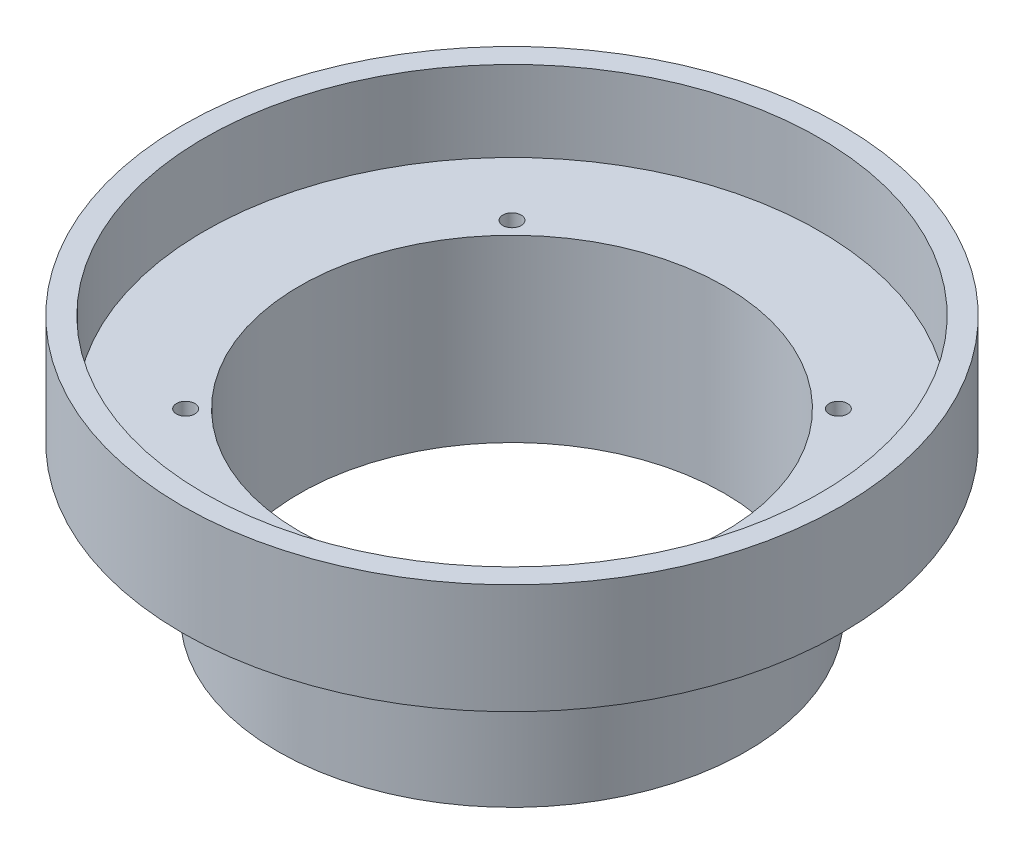
ISO-10303-21;
HEADER;
FILE_DESCRIPTION(('STEP AP214'),'2;1');
FILE_NAME('part.step','',(''),(''),'','','');
FILE_SCHEMA(('AUTOMOTIVE_DESIGN { 1 0 10303 214 1 1 1 1 }'));
ENDSEC;
DATA;
#1=APPLICATION_CONTEXT('core data for automotive mechanical design processes');
#2=APPLICATION_PROTOCOL_DEFINITION('international standard','automotive_design',2000,#1);
#3=PRODUCT_CONTEXT('',#1,'mechanical');
#4=PRODUCT('Part','Part','',(#3));
#5=PRODUCT_RELATED_PRODUCT_CATEGORY('part','',(#4));
#6=PRODUCT_DEFINITION_FORMATION('','',#4);
#7=PRODUCT_DEFINITION_CONTEXT('part definition',#1,'design');
#8=PRODUCT_DEFINITION('design','',#6,#7);
#9=PRODUCT_DEFINITION_SHAPE('','',#8);
#10=(LENGTH_UNIT() NAMED_UNIT(*) SI_UNIT(.MILLI.,.METRE.));
#11=(NAMED_UNIT(*) PLANE_ANGLE_UNIT() SI_UNIT($,.RADIAN.));
#12=(NAMED_UNIT(*) SI_UNIT($,.STERADIAN.) SOLID_ANGLE_UNIT());
#13=UNCERTAINTY_MEASURE_WITH_UNIT(LENGTH_MEASURE(1.E-05),#10,'distance_accuracy_value','');
#14=(GEOMETRIC_REPRESENTATION_CONTEXT(3) GLOBAL_UNCERTAINTY_ASSIGNED_CONTEXT((#13)) GLOBAL_UNIT_ASSIGNED_CONTEXT((#10,
#11,#12)) REPRESENTATION_CONTEXT('',''));
#15=CARTESIAN_POINT('',(0.,0.,0.));
#16=DIRECTION('',(0.,0.,1.));
#17=DIRECTION('',(1.,0.,0.));
#18=AXIS2_PLACEMENT_3D('',#15,#16,#17);
#19=CARTESIAN_POINT('',(0.,20.5,0.));
#20=DIRECTION('',(0.,1.,0.));
#21=DIRECTION('',(0.,0.,1.));
#22=AXIS2_PLACEMENT_3D('',#19,#20,#21);
#23=PLANE('',#22);
#24=CARTESIAN_POINT('',(0.,20.5,0.));
#25=DIRECTION('',(0.,1.,0.));
#26=DIRECTION('',(0.,0.,1.));
#27=AXIS2_PLACEMENT_3D('',#24,#25,#26);
#28=CIRCLE('',#27,45.);
#29=CARTESIAN_POINT('',(0.,20.5,45.));
#30=VERTEX_POINT('',#29);
#31=EDGE_CURVE('E110',#30,#30,#28,.T.);
#32=ORIENTED_EDGE('',*,*,#31,.F.);
#33=EDGE_LOOP('',(#32));
#34=FACE_BOUND('',#33,.T.);
#35=CARTESIAN_POINT('',(-22.2738636073763,20.5,-22.2738636073762));
#36=DIRECTION('',(0.,1.,0.));
#37=DIRECTION('',(0.,0.,1.));
#38=AXIS2_PLACEMENT_3D('',#35,#36,#37);
#39=CIRCLE('',#38,1.24999999999999);
#40=CARTESIAN_POINT('',(-23.4290492834822,20.5,-21.7963219299074));
#41=VERTEX_POINT('',#40);
#42=CARTESIAN_POINT('',(-21.7963219299074,20.5,-23.4290492834822));
#43=VERTEX_POINT('',#42);
#44=EDGE_CURVE('E59',#41,#43,#39,.F.);
#45=ORIENTED_EDGE('',*,*,#44,.F.);
#46=CARTESIAN_POINT('',(0.,20.5,0.));
#47=DIRECTION('',(0.,1.,0.));
#48=DIRECTION('',(0.,0.,1.));
#49=AXIS2_PLACEMENT_3D('',#46,#47,#48);
#50=CIRCLE('',#49,32.);
#51=CARTESIAN_POINT('',(-23.4290492834822,20.5,21.7963219299075));
#52=VERTEX_POINT('',#51);
#53=EDGE_CURVE('E53',#41,#52,#50,.T.);
#54=ORIENTED_EDGE('',*,*,#53,.T.);
#55=CARTESIAN_POINT('',(-22.2738636073763,20.5,22.2738636073762));
#56=DIRECTION('',(0.,1.,0.));
#57=DIRECTION('',(0.,0.,1.));
#58=AXIS2_PLACEMENT_3D('',#55,#56,#57);
#59=CIRCLE('',#58,1.24999999999999);
#60=CARTESIAN_POINT('',(-21.7963219299075,20.5,23.4290492834821));
#61=VERTEX_POINT('',#60);
#62=EDGE_CURVE('E128',#61,#52,#59,.F.);
#63=ORIENTED_EDGE('',*,*,#62,.F.);
#64=CARTESIAN_POINT('',(21.7963219299075,20.5,23.4290492834822));
#65=VERTEX_POINT('',#64);
#66=EDGE_CURVE('E51',#61,#65,#50,.T.);
#67=ORIENTED_EDGE('',*,*,#66,.T.);
#68=CARTESIAN_POINT('',(22.2738636073762,20.5,22.2738636073762));
#69=DIRECTION('',(0.,1.,0.));
#70=DIRECTION('',(0.,0.,1.));
#71=AXIS2_PLACEMENT_3D('',#68,#69,#70);
#72=CIRCLE('',#71,1.24999999999999);
#73=CARTESIAN_POINT('',(23.4290492834821,20.5,21.7963219299075));
#74=VERTEX_POINT('',#73);
#75=EDGE_CURVE('E134',#74,#65,#72,.F.);
#76=ORIENTED_EDGE('',*,*,#75,.F.);
#77=CARTESIAN_POINT('',(23.4290492834821,20.5,-21.7963219299075));
#78=VERTEX_POINT('',#77);
#79=EDGE_CURVE('E354',#74,#78,#50,.T.);
#80=ORIENTED_EDGE('',*,*,#79,.T.);
#81=CARTESIAN_POINT('',(22.2738636073762,20.5,-22.2738636073763));
#82=DIRECTION('',(0.,1.,0.));
#83=DIRECTION('',(0.,0.,1.));
#84=AXIS2_PLACEMENT_3D('',#81,#82,#83);
#85=CIRCLE('',#84,1.24999999999999);
#86=CARTESIAN_POINT('',(21.7963219299074,20.5,-23.4290492834822));
#87=VERTEX_POINT('',#86);
#88=EDGE_CURVE('E66',#87,#78,#85,.F.);
#89=ORIENTED_EDGE('',*,*,#88,.F.);
#90=EDGE_CURVE('E94',#87,#43,#50,.T.);
#91=ORIENTED_EDGE('',*,*,#90,.T.);
#92=EDGE_LOOP('',(#45,#54,#63,#67,#76,#80,#89,#91));
#93=FACE_BOUND('',#92,.T.);
#94=ADVANCED_FACE('F42',(#34,#93),#23,.F.);
#95=CARTESIAN_POINT('',(0.,117.52438661764,0.));
#96=DIRECTION('',(0.,-1.,0.));
#97=DIRECTION('',(0.,0.,-1.));
#98=AXIS2_PLACEMENT_3D('',#95,#96,#97);
#99=CYLINDRICAL_SURFACE('',#98,29.);
#100=CARTESIAN_POINT('',(0.,0.,0.));
#101=DIRECTION('',(0.,1.,0.));
#102=DIRECTION('',(0.,0.,1.));
#103=AXIS2_PLACEMENT_3D('',#100,#101,#102);
#104=CIRCLE('',#103,29.);
#105=CARTESIAN_POINT('',(0.,0.,-29.));
#106=VERTEX_POINT('',#105);
#107=EDGE_CURVE('E113',#106,#106,#104,.T.);
#108=CARTESIAN_POINT('',(0.,24.5,0.));
#109=DIRECTION('',(0.,1.,0.));
#110=DIRECTION('',(0.,0.,1.));
#111=AXIS2_PLACEMENT_3D('',#108,#109,#110);
#112=CIRCLE('',#111,29.);
#113=CARTESIAN_POINT('',(0.,24.5,-29.));
#114=VERTEX_POINT('',#113);
#115=EDGE_CURVE('E46',#114,#114,#112,.T.);
#116=CARTESIAN_POINT('',(0.,0.,-29.));
#117=CARTESIAN_POINT('',(0.,0.255208333333322,-29.));
#118=CARTESIAN_POINT('',(0.,0.510416666666657,-29.));
#119=CARTESIAN_POINT('',(0.,1.02083333333332,-29.));
#120=CARTESIAN_POINT('',(0.,1.27604166666665,-29.));
#121=CARTESIAN_POINT('',(0.,1.78645833333332,-29.));
#122=CARTESIAN_POINT('',(0.,2.04166666666665,-29.));
#123=CARTESIAN_POINT('',(0.,2.55208333333332,-29.));
#124=CARTESIAN_POINT('',(0.,2.80729166666665,-29.));
#125=CARTESIAN_POINT('',(0.,3.31770833333332,-29.));
#126=CARTESIAN_POINT('',(0.,3.57291666666665,-29.));
#127=CARTESIAN_POINT('',(0.,4.08333333333332,-29.));
#128=CARTESIAN_POINT('',(0.,4.33854166666665,-29.));
#129=CARTESIAN_POINT('',(0.,4.84895833333332,-29.));
#130=CARTESIAN_POINT('',(0.,5.10416666666665,-29.));
#131=CARTESIAN_POINT('',(0.,5.61458333333332,-29.));
#132=CARTESIAN_POINT('',(0.,5.86979166666665,-29.));
#133=CARTESIAN_POINT('',(0.,6.38020833333331,-29.));
#134=CARTESIAN_POINT('',(0.,6.63541666666665,-29.));
#135=CARTESIAN_POINT('',(0.,7.14583333333332,-29.));
#136=CARTESIAN_POINT('',(0.,7.40104166666665,-29.));
#137=CARTESIAN_POINT('',(0.,7.91145833333332,-29.));
#138=CARTESIAN_POINT('',(0.,8.16666666666665,-29.));
#139=CARTESIAN_POINT('',(0.,8.67708333333332,-29.));
#140=CARTESIAN_POINT('',(0.,8.93229166666665,-29.));
#141=CARTESIAN_POINT('',(0.,9.44270833333332,-29.));
#142=CARTESIAN_POINT('',(0.,9.69791666666665,-29.));
#143=CARTESIAN_POINT('',(0.,10.2083333333333,-29.));
#144=CARTESIAN_POINT('',(0.,10.4635416666667,-29.));
#145=CARTESIAN_POINT('',(0.,10.9739583333333,-29.));
#146=CARTESIAN_POINT('',(0.,11.2291666666666,-29.));
#147=CARTESIAN_POINT('',(0.,11.7395833333333,-29.));
#148=CARTESIAN_POINT('',(0.,11.9947916666666,-29.));
#149=CARTESIAN_POINT('',(0.,12.5052083333333,-29.));
#150=CARTESIAN_POINT('',(0.,12.7604166666667,-29.));
#151=CARTESIAN_POINT('',(0.,13.2708333333333,-29.));
#152=CARTESIAN_POINT('',(0.,13.5260416666667,-29.));
#153=CARTESIAN_POINT('',(0.,14.0364583333333,-29.));
#154=CARTESIAN_POINT('',(0.,14.2916666666667,-29.));
#155=CARTESIAN_POINT('',(0.,14.8020833333333,-29.));
#156=CARTESIAN_POINT('',(0.,15.0572916666666,-29.));
#157=CARTESIAN_POINT('',(0.,15.5677083333333,-29.));
#158=CARTESIAN_POINT('',(0.,15.8229166666666,-29.));
#159=CARTESIAN_POINT('',(0.,16.3333333333333,-29.));
#160=CARTESIAN_POINT('',(0.,16.5885416666666,-29.));
#161=CARTESIAN_POINT('',(0.,17.0989583333333,-29.));
#162=CARTESIAN_POINT('',(0.,17.3541666666666,-29.));
#163=CARTESIAN_POINT('',(0.,17.8645833333333,-29.));
#164=CARTESIAN_POINT('',(0.,18.1197916666667,-29.));
#165=CARTESIAN_POINT('',(0.,18.6302083333333,-29.));
#166=CARTESIAN_POINT('',(0.,18.8854166666667,-29.));
#167=CARTESIAN_POINT('',(0.,19.3958333333333,-29.));
#168=CARTESIAN_POINT('',(0.,19.6510416666666,-29.));
#169=CARTESIAN_POINT('',(0.,20.1614583333333,-29.));
#170=CARTESIAN_POINT('',(0.,20.4166666666666,-29.));
#171=CARTESIAN_POINT('',(0.,20.9270833333333,-29.));
#172=CARTESIAN_POINT('',(0.,21.1822916666666,-29.));
#173=CARTESIAN_POINT('',(0.,21.6927083333333,-29.));
#174=CARTESIAN_POINT('',(0.,21.9479166666666,-29.));
#175=CARTESIAN_POINT('',(0.,22.4583333333333,-29.));
#176=CARTESIAN_POINT('',(0.,22.7135416666666,-29.));
#177=CARTESIAN_POINT('',(0.,23.2239583333333,-29.));
#178=CARTESIAN_POINT('',(0.,23.4791666666667,-29.));
#179=CARTESIAN_POINT('',(0.,23.9895833333333,-29.));
#180=CARTESIAN_POINT('',(0.,24.2447916666667,-29.));
#181=CARTESIAN_POINT('',(0.,24.5,-29.));
#182=B_SPLINE_CURVE_WITH_KNOTS('',3,(#116,#117,#118,#119,#120,#121,#122,#123,#124,#125,#126,
#127,#128,#129,#130,#131,#132,#133,#134,#135,#136,#137,#138,#139,#140,#141,#142,#143,#144,#145,
#146,#147,#148,#149,#150,#151,#152,#153,#154,#155,#156,#157,#158,#159,#160,#161,#162,#163,#164,
#165,#166,#167,#168,#169,#170,#171,#172,#173,#174,#175,#176,#177,#178,#179,#180,#181),
.UNSPECIFIED.,.F.,.F.,(4,2,2,2,2,2,2,2,2,2,2,2,2,2,2,2,2,2,2,2,2,2,2,2,2,2,2,2,2,2,2,2,4),(0.,
0.765625000000006,1.53125,2.296875,3.0625,3.828125,4.59374999999999,5.359375,6.12499999999999,
6.890625,7.65625,8.42187499999999,9.1875,9.95312499999999,10.71875,11.484375,12.25,13.015625,
13.78125,14.546875,15.3125,16.078125,16.84375,17.609375,18.375,19.140625,19.90625,20.671875,
21.4375,22.203125,22.96875,23.734375,24.5),.UNSPECIFIED.);
#183=EDGE_CURVE('BSEAM179',#106,#114,#182,.T.);
#184=ORIENTED_EDGE('',*,*,#107,.F.);
#185=ORIENTED_EDGE('',*,*,#115,.T.);
#186=ORIENTED_EDGE('',*,*,#183,.T.);
#187=ORIENTED_EDGE('',*,*,#183,.F.);
#188=EDGE_LOOP('',(#184,#186,#185,#187));
#189=FACE_BOUND('',#188,.T.);
#190=ADVANCED_FACE('F179',(#189),#99,.F.);
#191=CARTESIAN_POINT('',(0.,20.5,0.));
#192=DIRECTION('',(0.,-1.,0.));
#193=DIRECTION('',(0.,0.,-1.));
#194=AXIS2_PLACEMENT_3D('',#191,#192,#193);
#195=CYLINDRICAL_SURFACE('',#194,32.);
#196=EDGE_CURVE('E12',#52,#61,#50,.T.);
#197=ORIENTED_EDGE('',*,*,#196,.F.);
#198=ORIENTED_EDGE('',*,*,#53,.F.);
#199=EDGE_CURVE('E87',#43,#41,#50,.T.);
#200=ORIENTED_EDGE('',*,*,#199,.F.);
#201=ORIENTED_EDGE('',*,*,#90,.F.);
#202=EDGE_CURVE('E351',#78,#87,#50,.T.);
#203=ORIENTED_EDGE('',*,*,#202,.F.);
#204=ORIENTED_EDGE('',*,*,#79,.F.);
#205=EDGE_CURVE('E358',#65,#74,#50,.T.);
#206=ORIENTED_EDGE('',*,*,#205,.F.);
#207=ORIENTED_EDGE('',*,*,#66,.F.);
#208=EDGE_LOOP('',(#197,#198,#200,#201,#203,#204,#206,#207));
#209=FACE_BOUND('',#208,.T.);
#210=CARTESIAN_POINT('',(0.,0.,0.));
#211=DIRECTION('',(0.,1.,0.));
#212=DIRECTION('',(0.,0.,1.));
#213=AXIS2_PLACEMENT_3D('',#210,#211,#212);
#214=CIRCLE('',#213,32.);
#215=CARTESIAN_POINT('',(0.,0.,32.));
#216=VERTEX_POINT('',#215);
#217=EDGE_CURVE('E106',#216,#216,#214,.T.);
#218=ORIENTED_EDGE('',*,*,#217,.T.);
#219=EDGE_LOOP('',(#218));
#220=FACE_BOUND('',#219,.T.);
#221=ADVANCED_FACE('F44',(#209,#220),#195,.T.);
#222=CARTESIAN_POINT('',(0.,0.,0.));
#223=DIRECTION('',(0.,1.,0.));
#224=DIRECTION('',(0.,0.,1.));
#225=AXIS2_PLACEMENT_3D('',#222,#223,#224);
#226=PLANE('',#225);
#227=ORIENTED_EDGE('',*,*,#107,.T.);
#228=EDGE_LOOP('',(#227));
#229=FACE_BOUND('',#228,.T.);
#230=ORIENTED_EDGE('',*,*,#217,.F.);
#231=EDGE_LOOP('',(#230));
#232=FACE_BOUND('',#231,.T.);
#233=ADVANCED_FACE('F174',(#229,#232),#226,.F.);
#234=CARTESIAN_POINT('',(0.,35.5,0.));
#235=DIRECTION('',(0.,-1.,0.));
#236=DIRECTION('',(0.,0.,-1.));
#237=AXIS2_PLACEMENT_3D('',#234,#235,#236);
#238=CYLINDRICAL_SURFACE('',#237,45.);
#239=CARTESIAN_POINT('',(0.,35.5,0.));
#240=DIRECTION('',(0.,1.,0.));
#241=DIRECTION('',(0.,0.,1.));
#242=AXIS2_PLACEMENT_3D('',#239,#240,#241);
#243=CIRCLE('',#242,45.);
#244=CARTESIAN_POINT('',(0.,35.5,45.));
#245=VERTEX_POINT('',#244);
#246=EDGE_CURVE('E108',#245,#245,#243,.T.);
#247=ORIENTED_EDGE('',*,*,#246,.F.);
#248=EDGE_LOOP('',(#247));
#249=FACE_BOUND('',#248,.T.);
#250=ORIENTED_EDGE('',*,*,#31,.T.);
#251=EDGE_LOOP('',(#250));
#252=FACE_BOUND('',#251,.T.);
#253=ADVANCED_FACE('F168',(#249,#252),#238,.T.);
#254=CARTESIAN_POINT('',(0.,35.5,0.));
#255=DIRECTION('',(0.,1.,0.));
#256=DIRECTION('',(0.,0.,1.));
#257=AXIS2_PLACEMENT_3D('',#254,#255,#256);
#258=PLANE('',#257);
#259=CARTESIAN_POINT('',(0.,35.5,0.));
#260=DIRECTION('',(0.,1.,0.));
#261=DIRECTION('',(0.,0.,1.));
#262=AXIS2_PLACEMENT_3D('',#259,#260,#261);
#263=CIRCLE('',#262,42.);
#264=CARTESIAN_POINT('',(0.,35.5,42.));
#265=VERTEX_POINT('',#264);
#266=EDGE_CURVE('E121',#265,#265,#263,.T.);
#267=ORIENTED_EDGE('',*,*,#266,.F.);
#268=EDGE_LOOP('',(#267));
#269=FACE_BOUND('',#268,.T.);
#270=ORIENTED_EDGE('',*,*,#246,.T.);
#271=EDGE_LOOP('',(#270));
#272=FACE_BOUND('',#271,.T.);
#273=ADVANCED_FACE('F162',(#269,#272),#258,.T.);
#274=CARTESIAN_POINT('',(0.,-98.29393923934,0.));
#275=DIRECTION('',(0.,1.,0.));
#276=DIRECTION('',(0.,0.,1.));
#277=AXIS2_PLACEMENT_3D('',#274,#275,#276);
#278=CYLINDRICAL_SURFACE('',#277,42.);
#279=CARTESIAN_POINT('',(0.,24.5,0.));
#280=DIRECTION('',(0.,1.,0.));
#281=DIRECTION('',(0.,0.,1.));
#282=AXIS2_PLACEMENT_3D('',#279,#280,#281);
#283=CIRCLE('',#282,42.);
#284=CARTESIAN_POINT('',(0.,24.5,42.));
#285=VERTEX_POINT('',#284);
#286=EDGE_CURVE('E118',#285,#285,#283,.F.);
#287=ORIENTED_EDGE('',*,*,#286,.T.);
#288=EDGE_LOOP('',(#287));
#289=FACE_BOUND('',#288,.T.);
#290=ORIENTED_EDGE('',*,*,#266,.T.);
#291=EDGE_LOOP('',(#290));
#292=FACE_BOUND('',#291,.T.);
#293=ADVANCED_FACE('F147',(#289,#292),#278,.F.);
#294=CARTESIAN_POINT('',(0.,24.5,0.));
#295=DIRECTION('',(0.,1.,0.));
#296=DIRECTION('',(0.,0.,1.));
#297=AXIS2_PLACEMENT_3D('',#294,#295,#296);
#298=PLANE('',#297);
#299=CARTESIAN_POINT('',(-22.2738636073763,24.5,-22.2738636073762));
#300=DIRECTION('',(0.,1.,0.));
#301=DIRECTION('',(0.,0.,1.));
#302=AXIS2_PLACEMENT_3D('',#299,#300,#301);
#303=CIRCLE('',#302,1.24999999999999);
#304=CARTESIAN_POINT('',(-22.2738636073763,24.5,-21.0238636073763));
#305=VERTEX_POINT('',#304);
#306=EDGE_CURVE('E97',#305,#305,#303,.T.);
#307=ORIENTED_EDGE('',*,*,#306,.F.);
#308=EDGE_LOOP('',(#307));
#309=FACE_BOUND('',#308,.T.);
#310=CARTESIAN_POINT('',(22.2738636073762,24.5,-22.2738636073763));
#311=DIRECTION('',(0.,1.,0.));
#312=DIRECTION('',(0.,0.,1.));
#313=AXIS2_PLACEMENT_3D('',#310,#311,#312);
#314=CIRCLE('',#313,1.24999999999999);
#315=CARTESIAN_POINT('',(22.2738636073762,24.5,-21.0238636073763));
#316=VERTEX_POINT('',#315);
#317=EDGE_CURVE('E102',#316,#316,#314,.T.);
#318=ORIENTED_EDGE('',*,*,#317,.F.);
#319=EDGE_LOOP('',(#318));
#320=FACE_BOUND('',#319,.T.);
#321=CARTESIAN_POINT('',(22.2738636073762,24.5,22.2738636073762));
#322=DIRECTION('',(0.,1.,0.));
#323=DIRECTION('',(0.,0.,1.));
#324=AXIS2_PLACEMENT_3D('',#321,#322,#323);
#325=CIRCLE('',#324,1.24999999999999);
#326=CARTESIAN_POINT('',(22.2738636073762,24.5,23.5238636073762));
#327=VERTEX_POINT('',#326);
#328=EDGE_CURVE('E131',#327,#327,#325,.T.);
#329=ORIENTED_EDGE('',*,*,#328,.F.);
#330=EDGE_LOOP('',(#329));
#331=FACE_BOUND('',#330,.T.);
#332=CARTESIAN_POINT('',(-22.2738636073763,24.5,22.2738636073762));
#333=DIRECTION('',(0.,1.,0.));
#334=DIRECTION('',(0.,0.,1.));
#335=AXIS2_PLACEMENT_3D('',#332,#333,#334);
#336=CIRCLE('',#335,1.24999999999999);
#337=CARTESIAN_POINT('',(-22.2738636073763,24.5,23.5238636073762));
#338=VERTEX_POINT('',#337);
#339=EDGE_CURVE('E125',#338,#338,#336,.T.);
#340=ORIENTED_EDGE('',*,*,#339,.F.);
#341=EDGE_LOOP('',(#340));
#342=FACE_BOUND('',#341,.T.);
#343=ORIENTED_EDGE('',*,*,#115,.F.);
#344=EDGE_LOOP('',(#343));
#345=FACE_BOUND('',#344,.T.);
#346=ORIENTED_EDGE('',*,*,#286,.F.);
#347=EDGE_LOOP('',(#346));
#348=FACE_BOUND('',#347,.T.);
#349=ADVANCED_FACE('F143',(#309,#320,#331,#342,#345,#348),#298,.T.);
#350=CARTESIAN_POINT('',(0.,20.5,0.));
#351=DIRECTION('',(0.,1.,0.));
#352=DIRECTION('',(0.,0.,1.));
#353=AXIS2_PLACEMENT_3D('',#350,#351,#352);
#354=PLANE('',#353);
#355=ORIENTED_EDGE('',*,*,#196,.T.);
#356=EDGE_CURVE('E124',#52,#61,#59,.F.);
#357=ORIENTED_EDGE('',*,*,#356,.F.);
#358=EDGE_LOOP('',(#355,#357));
#359=FACE_BOUND('',#358,.T.);
#360=ADVANCED_FACE('F146',(#359),#354,.T.);
#361=CARTESIAN_POINT('',(-22.2738636073763,24.5,22.2738636073762));
#362=DIRECTION('',(0.,1.,0.));
#363=DIRECTION('',(0.,0.,1.));
#364=AXIS2_PLACEMENT_3D('',#361,#362,#363);
#365=CYLINDRICAL_SURFACE('',#364,1.24999999999999);
#366=ORIENTED_EDGE('',*,*,#356,.T.);
#367=ORIENTED_EDGE('',*,*,#62,.T.);
#368=EDGE_LOOP('',(#366,#367));
#369=FACE_BOUND('',#368,.T.);
#370=ORIENTED_EDGE('',*,*,#339,.T.);
#371=EDGE_LOOP('',(#370));
#372=FACE_BOUND('',#371,.T.);
#373=ADVANCED_FACE('F243',(#369,#372),#365,.F.);
#374=CARTESIAN_POINT('',(0.,20.5,0.));
#375=DIRECTION('',(0.,1.,0.));
#376=DIRECTION('',(0.,0.,1.));
#377=AXIS2_PLACEMENT_3D('',#374,#375,#376);
#378=PLANE('',#377);
#379=ORIENTED_EDGE('',*,*,#205,.T.);
#380=EDGE_CURVE('E129',#65,#74,#72,.F.);
#381=ORIENTED_EDGE('',*,*,#380,.F.);
#382=EDGE_LOOP('',(#379,#381));
#383=FACE_BOUND('',#382,.T.);
#384=ADVANCED_FACE('F254',(#383),#378,.T.);
#385=CARTESIAN_POINT('',(22.2738636073762,24.5,22.2738636073762));
#386=DIRECTION('',(0.,1.,0.));
#387=DIRECTION('',(0.,0.,1.));
#388=AXIS2_PLACEMENT_3D('',#385,#386,#387);
#389=CYLINDRICAL_SURFACE('',#388,1.24999999999999);
#390=ORIENTED_EDGE('',*,*,#380,.T.);
#391=ORIENTED_EDGE('',*,*,#75,.T.);
#392=EDGE_LOOP('',(#390,#391));
#393=FACE_BOUND('',#392,.T.);
#394=ORIENTED_EDGE('',*,*,#328,.T.);
#395=EDGE_LOOP('',(#394));
#396=FACE_BOUND('',#395,.T.);
#397=ADVANCED_FACE('F265',(#393,#396),#389,.F.);
#398=CARTESIAN_POINT('',(0.,20.5,0.));
#399=DIRECTION('',(0.,1.,0.));
#400=DIRECTION('',(0.,0.,1.));
#401=AXIS2_PLACEMENT_3D('',#398,#399,#400);
#402=PLANE('',#401);
#403=ORIENTED_EDGE('',*,*,#202,.T.);
#404=EDGE_CURVE('E138',#78,#87,#85,.F.);
#405=ORIENTED_EDGE('',*,*,#404,.F.);
#406=EDGE_LOOP('',(#403,#405));
#407=FACE_BOUND('',#406,.T.);
#408=ADVANCED_FACE('F275',(#407),#402,.T.);
#409=CARTESIAN_POINT('',(22.2738636073762,24.5,-22.2738636073763));
#410=DIRECTION('',(0.,1.,0.));
#411=DIRECTION('',(0.,0.,1.));
#412=AXIS2_PLACEMENT_3D('',#409,#410,#411);
#413=CYLINDRICAL_SURFACE('',#412,1.24999999999999);
#414=ORIENTED_EDGE('',*,*,#88,.T.);
#415=ORIENTED_EDGE('',*,*,#404,.T.);
#416=EDGE_LOOP('',(#414,#415));
#417=FACE_BOUND('',#416,.T.);
#418=ORIENTED_EDGE('',*,*,#317,.T.);
#419=EDGE_LOOP('',(#418));
#420=FACE_BOUND('',#419,.T.);
#421=ADVANCED_FACE('F287',(#417,#420),#413,.F.);
#422=CARTESIAN_POINT('',(0.,20.5,0.));
#423=DIRECTION('',(0.,1.,0.));
#424=DIRECTION('',(0.,0.,1.));
#425=AXIS2_PLACEMENT_3D('',#422,#423,#424);
#426=PLANE('',#425);
#427=ORIENTED_EDGE('',*,*,#199,.T.);
#428=EDGE_CURVE('E89',#43,#41,#39,.F.);
#429=ORIENTED_EDGE('',*,*,#428,.F.);
#430=EDGE_LOOP('',(#427,#429));
#431=FACE_BOUND('',#430,.T.);
#432=ADVANCED_FACE('F88',(#431),#426,.T.);
#433=CARTESIAN_POINT('',(-22.2738636073763,24.5,-22.2738636073762));
#434=DIRECTION('',(0.,1.,0.));
#435=DIRECTION('',(0.,0.,1.));
#436=AXIS2_PLACEMENT_3D('',#433,#434,#435);
#437=CYLINDRICAL_SURFACE('',#436,1.24999999999999);
#438=ORIENTED_EDGE('',*,*,#44,.T.);
#439=ORIENTED_EDGE('',*,*,#428,.T.);
#440=EDGE_LOOP('',(#438,#439));
#441=FACE_BOUND('',#440,.T.);
#442=ORIENTED_EDGE('',*,*,#306,.T.);
#443=EDGE_LOOP('',(#442));
#444=FACE_BOUND('',#443,.T.);
#445=ADVANCED_FACE('F95',(#441,#444),#437,.F.);
#446=CLOSED_SHELL('',(#94,#190,#221,#233,#253,#273,#293,#349,#360,#373,#384,#397,#408,#421,#432,#445));
#447=MANIFOLD_SOLID_BREP('B2',#446);
#448=ADVANCED_BREP_SHAPE_REPRESENTATION('',(#18,#447),#14);
#449=SHAPE_DEFINITION_REPRESENTATION(#9,#448);
ENDSEC;
END-ISO-10303-21;
